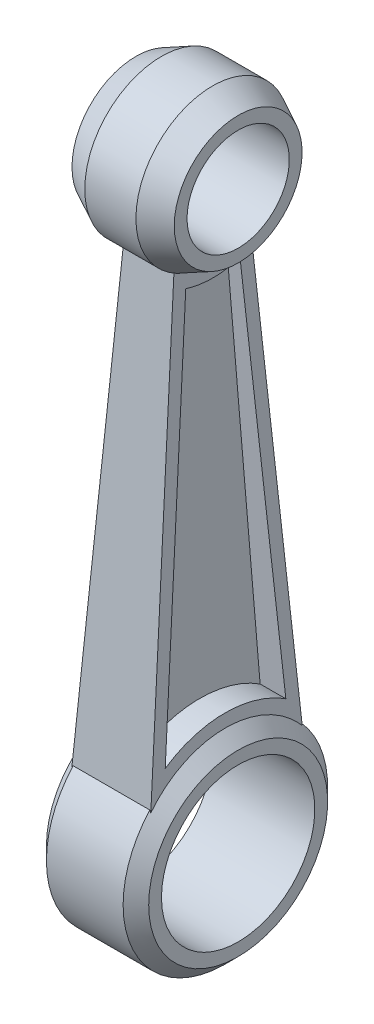
ISO-10303-21;
HEADER;
FILE_DESCRIPTION(('STEP AP214'),'2;1');
FILE_NAME('part.step','',(''),(''),'','','');
FILE_SCHEMA(('AUTOMOTIVE_DESIGN { 1 0 10303 214 1 1 1 1 }'));
ENDSEC;
DATA;
#1=APPLICATION_CONTEXT('core data for automotive mechanical design processes');
#2=APPLICATION_PROTOCOL_DEFINITION('international standard','automotive_design',2000,#1);
#3=PRODUCT_CONTEXT('',#1,'mechanical');
#4=PRODUCT('Part','Part','',(#3));
#5=PRODUCT_RELATED_PRODUCT_CATEGORY('part','',(#4));
#6=PRODUCT_DEFINITION_FORMATION('','',#4);
#7=PRODUCT_DEFINITION_CONTEXT('part definition',#1,'design');
#8=PRODUCT_DEFINITION('design','',#6,#7);
#9=PRODUCT_DEFINITION_SHAPE('','',#8);
#10=(LENGTH_UNIT() NAMED_UNIT(*) SI_UNIT(.MILLI.,.METRE.));
#11=(NAMED_UNIT(*) PLANE_ANGLE_UNIT() SI_UNIT($,.RADIAN.));
#12=(NAMED_UNIT(*) SI_UNIT($,.STERADIAN.) SOLID_ANGLE_UNIT());
#13=UNCERTAINTY_MEASURE_WITH_UNIT(LENGTH_MEASURE(1.E-05),#10,'distance_accuracy_value','');
#14=(GEOMETRIC_REPRESENTATION_CONTEXT(3) GLOBAL_UNCERTAINTY_ASSIGNED_CONTEXT((#13)) GLOBAL_UNIT_ASSIGNED_CONTEXT((#10,
#11,#12)) REPRESENTATION_CONTEXT('',''));
#15=CARTESIAN_POINT('',(0.,0.,0.));
#16=DIRECTION('',(0.,0.,1.));
#17=DIRECTION('',(1.,0.,0.));
#18=AXIS2_PLACEMENT_3D('',#15,#16,#17);
#19=CARTESIAN_POINT('',(2.,39.,0.));
#20=DIRECTION('',(-0.9994801143397,-0.0322412940109581,0.));
#21=DIRECTION('',(0.0322412940109581,-0.9994801143397,0.));
#22=AXIS2_PLACEMENT_3D('',#19,#20,#21);
#23=PLANE('',#22);
#24=DIRECTION('',(-0.0321267246803745,0.995928465091609,-0.0842280593483143));
#25=VECTOR('',#24,1.);
#26=CARTESIAN_POINT('',(2.01332038910498,38.5870679377456,3.10290597295482));
#27=LINE('',#26,#25);
#28=CARTESIAN_POINT('',(3.08888077576671,5.24469595123219,5.92275035428325));
#29=VERTEX_POINT('',#28);
#30=CARTESIAN_POINT('',(1.97406943299054,39.8038475772933,3.));
#31=VERTEX_POINT('',#30);
#32=EDGE_CURVE('E488',#29,#31,#27,.T.);
#33=ORIENTED_EDGE('',*,*,#32,.F.);
#34=CARTESIAN_POINT('',(3.25,0.25,0.));
#35=DIRECTION('',(-0.9994801143397,-0.0322412940109581,0.));
#36=DIRECTION('',(-0.0322412940109581,0.9994801143397,0.));
#37=AXIS2_PLACEMENT_3D('',#34,#35,#36);
#38=ELLIPSE('',#37,7.75403120963541,7.74596669241483);
#39=CARTESIAN_POINT('',(3.08888077576671,5.2446959512322,-5.92275035428325));
#40=VERTEX_POINT('',#39);
#41=EDGE_CURVE('E510',#40,#29,#38,.F.);
#42=ORIENTED_EDGE('',*,*,#41,.F.);
#43=DIRECTION('',(0.0321267246803745,-0.995928465091609,-0.0842280593483142));
#44=VECTOR('',#43,1.);
#45=CARTESIAN_POINT('',(2.01332038910498,38.5870679377456,-3.10290597295482));
#46=LINE('',#45,#44);
#47=CARTESIAN_POINT('',(1.97406943299054,39.8038475772934,-3.));
#48=VERTEX_POINT('',#47);
#49=EDGE_CURVE('E492',#48,#40,#46,.T.);
#50=ORIENTED_EDGE('',*,*,#49,.F.);
#51=CARTESIAN_POINT('',(1.80645161290323,45.,0.));
#52=DIRECTION('',(-0.9994801143397,-0.0322412940109581,0.));
#53=DIRECTION('',(-0.0322412940109581,0.9994801143397,0.));
#54=AXIS2_PLACEMENT_3D('',#51,#52,#53);
#55=ELLIPSE('',#54,6.00312093649194,6.00000000000001);
#56=CARTESIAN_POINT('',(2.,39.,0.));
#57=VERTEX_POINT('',#56);
#58=EDGE_CURVE('E476',#57,#48,#55,.F.);
#59=ORIENTED_EDGE('',*,*,#58,.F.);
#60=EDGE_CURVE('E502',#31,#57,#55,.F.);
#61=ORIENTED_EDGE('',*,*,#60,.F.);
#62=EDGE_LOOP('',(#33,#42,#50,#59,#61));
#63=FACE_BOUND('',#62,.T.);
#64=CARTESIAN_POINT('',(3.0123442683023,7.61732768262882,4.71852132391253));
#65=CARTESIAN_POINT('',(3.00806604240991,7.74995268529293,4.51158144660242));
#66=CARTESIAN_POINT('',(3.00406917587724,7.87385554780555,4.29904385747414));
#67=CARTESIAN_POINT('',(2.99666542594406,8.10337179573424,3.86431802858974));
#68=CARTESIAN_POINT('',(2.99325851068763,8.20898616868343,3.64213031072753));
#69=CARTESIAN_POINT('',(2.98706431982178,8.40100608552498,3.18983515443123));
#70=CARTESIAN_POINT('',(2.98427647515177,8.48742927029526,2.95973521567131));
#71=CARTESIAN_POINT('',(2.97933632956104,8.64057378360785,2.49306845227721));
#72=CARTESIAN_POINT('',(2.97718402121897,8.70729534221189,2.25650170319313));
#73=CARTESIAN_POINT('',(2.97352743279876,8.82064958323831,1.7785521675483));
#74=CARTESIAN_POINT('',(2.97202327337534,8.86727852536455,1.53716849304637));
#75=CARTESIAN_POINT('',(2.96967548609557,8.94005993103735,1.05121977536935));
#76=CARTESIAN_POINT('',(2.96883214969035,8.96620335959924,0.806653376764444));
#77=CARTESIAN_POINT('',(2.96781416775673,8.99776079954137,0.316201086897768));
#78=CARTESIAN_POINT('',(2.96763947796724,9.00317618301546,0.0703152840530583));
#79=CARTESIAN_POINT('',(2.96795748806564,8.99331786996515,-0.421037039626619));
#80=CARTESIAN_POINT('',(2.96845019959297,8.97804381261795,-0.666503553074446));
#81=CARTESIAN_POINT('',(2.9701027727946,8.9268140433674,-1.15534495339835));
#82=CARTESIAN_POINT('',(2.97126275525727,8.89085458702455,-1.39871945348372));
#83=CARTESIAN_POINT('',(2.9734933711298,8.82170549497608,-1.76080126110431));
#84=CARTESIAN_POINT('',(2.97431879150302,8.79611746340644,-1.88101051914152));
#85=CARTESIAN_POINT('',(2.97613318469048,8.73987127459528,-2.12028677892795));
#86=CARTESIAN_POINT('',(2.97712221240622,8.70921141540729,-2.23935338299977));
#87=CARTESIAN_POINT('',(2.97925929516108,8.64296185000654,-2.47591900346926));
#88=CARTESIAN_POINT('',(2.98040711789562,8.60737934523581,-2.59342003977918));
#89=CARTESIAN_POINT('',(2.98285919105712,8.53136507722924,-2.82684477965229));
#90=CARTESIAN_POINT('',(2.98416345722333,8.49093282607675,-2.94276832320072));
#91=CARTESIAN_POINT('',(2.98831148970181,8.36234381924384,-3.28777756364028));
#92=CARTESIAN_POINT('',(2.99139132753833,8.26686884631184,-3.51419487303131));
#93=CARTESIAN_POINT('',(2.99736153293332,8.08179247906707,-3.90563541330948));
#94=CARTESIAN_POINT('',(3.00012517196139,7.99611966919686,-4.07254038576338));
#95=CARTESIAN_POINT('',(3.00598713418035,7.81439884040928,-4.4001967115958));
#96=CARTESIAN_POINT('',(3.00908483146566,7.71837022456454,-4.56095883428714));
#97=CARTESIAN_POINT('',(3.0123442683023,7.61732768262875,-4.7185213239117));
#98=B_SPLINE_CURVE_WITH_KNOTS('',3,(#64,#65,#66,#67,#68,#69,#70,#71,#72,#73,#74,#75,#76,#77,#78,
#79,#80,#81,#82,#83,#84,#85,#86,#87,#88,#89,#90,#91,#92,#93,#94,#95,#96,#97),.UNSPECIFIED.,.F.,
.F.,(4,2,2,2,2,2,2,2,2,2,2,2,2,2,2,2,4),(0.,0.737273480682664,1.47450713800115,2.21106028582351,
2.94760483235695,3.68428642952581,4.4212927520901,5.15825028764485,5.89522067586761,
6.63232451134959,7.00095082870128,7.36970109736712,7.73791750830683,8.10617099538117,
8.84238918119858,9.4049129555388,9.96640049516694),.UNSPECIFIED.);
#99=CARTESIAN_POINT('',(3.0123442683023,7.61732768262882,4.71852132391253));
#100=VERTEX_POINT('',#99);
#101=CARTESIAN_POINT('',(3.0123442683023,7.61732768262875,-4.7185213239117));
#102=VERTEX_POINT('',#101);
#103=EDGE_CURVE('E12',#100,#102,#98,.T.);
#104=ORIENTED_EDGE('',*,*,#103,.F.);
#105=DIRECTION('',(0.0321267246803746,-0.995928465091611,0.0842280593482874));
#106=VECTOR('',#105,1.);
#107=CARTESIAN_POINT('',(1.99441375569753,39.1731735733767,2.04976774006267));
#108=LINE('',#107,#106);
#109=CARTESIAN_POINT('',(2.02164147130858,38.3291143894341,2.12115184999676));
#110=VERTEX_POINT('',#109);
#111=EDGE_CURVE('E68',#110,#100,#108,.T.);
#112=ORIENTED_EDGE('',*,*,#111,.F.);
#113=CARTESIAN_POINT('',(1.80645161290323,45.,0.));
#114=DIRECTION('',(-0.9994801143397,-0.0322412940109581,0.));
#115=DIRECTION('',(0.0322412940109581,-0.9994801143397,0.));
#116=AXIS2_PLACEMENT_3D('',#113,#114,#115);
#117=ELLIPSE('',#116,7.00364109257392,7.);
#118=CARTESIAN_POINT('',(2.02164147130858,38.3291143894341,-2.12115184999676));
#119=VERTEX_POINT('',#118);
#120=EDGE_CURVE('E516',#110,#119,#117,.F.);
#121=ORIENTED_EDGE('',*,*,#120,.T.);
#122=DIRECTION('',(-0.0321267246803746,0.995928465091613,0.0842280593482607));
#123=VECTOR('',#122,1.);
#124=CARTESIAN_POINT('',(1.99441375569753,39.1731735733767,-2.0497677400627));
#125=LINE('',#124,#123);
#126=EDGE_CURVE('E513',#102,#119,#125,.T.);
#127=ORIENTED_EDGE('',*,*,#126,.F.);
#128=EDGE_LOOP('',(#104,#112,#121,#127));
#129=FACE_BOUND('',#128,.T.);
#130=ADVANCED_FACE('F53',(#63,#129),#23,.F.);
#131=CARTESIAN_POINT('',(40.0032823696505,39.8038475772934,-3.));
#132=DIRECTION('',(0.,-0.0842715600283299,0.996442825339413));
#133=DIRECTION('',(0.,-0.996442825339413,-0.0842715600283299));
#134=AXIS2_PLACEMENT_3D('',#131,#132,#133);
#135=PLANE('',#134);
#136=DIRECTION('',(-1.,0.,0.));
#137=VECTOR('',#136,1.);
#138=CARTESIAN_POINT('',(0.,5.39146631945272,-5.91033763216679));
#139=LINE('',#138,#137);
#140=CARTESIAN_POINT('',(-3.,5.39146631945272,-5.91033763216679));
#141=VERTEX_POINT('',#140);
#142=CARTESIAN_POINT('',(3.,5.39146631945272,-5.91033763216679));
#143=VERTEX_POINT('',#142);
#144=EDGE_CURVE('E479',#141,#143,#139,.F.);
#145=ORIENTED_EDGE('',*,*,#144,.F.);
#146=CARTESIAN_POINT('',(-2.9998,5.39179340287246,-5.91030996993737));
#147=CARTESIAN_POINT('',(-3.01978271852244,5.35911867481869,-5.91307335006974));
#148=CARTESIAN_POINT('',(-3.03966955682412,5.32638648699748,-5.91584158971249));
#149=CARTESIAN_POINT('',(-3.07925147549856,5.26080718765726,-5.92138778837079));
#150=CARTESIAN_POINT('',(-3.09894655584697,5.22796007612366,-5.92416574738757));
#151=CARTESIAN_POINT('',(-3.11854575595028,5.19505550480802,-5.92694856591596));
#152=B_SPLINE_CURVE_WITH_KNOTS('',3,(#146,#147,#148,#149,#150,#151),.UNSPECIFIED.,.F.,.F.,(4,2,
4),(0.,0.115199437807998,0.230398890241468),.UNSPECIFIED.);
#153=CARTESIAN_POINT('',(-3.08888077576671,5.2446959512322,-5.92275035428325));
#154=VERTEX_POINT('',#153);
#155=EDGE_CURVE('E226',#141,#154,#152,.T.);
#156=ORIENTED_EDGE('',*,*,#155,.T.);
#157=DIRECTION('',(-0.0321267246803745,-0.995928465091609,-0.0842280593483142));
#158=VECTOR('',#157,1.);
#159=CARTESIAN_POINT('',(-2.01332038910498,38.5870679377456,-3.10290597295482));
#160=LINE('',#159,#158);
#161=CARTESIAN_POINT('',(-1.97406943299054,39.8038475772934,-3.));
#162=VERTEX_POINT('',#161);
#163=EDGE_CURVE('E459',#162,#154,#160,.T.);
#164=ORIENTED_EDGE('',*,*,#163,.F.);
#165=DIRECTION('',(-1.,0.,0.));
#166=VECTOR('',#165,1.);
#167=CARTESIAN_POINT('',(40.0032823696505,39.8038475772934,-3.));
#168=LINE('',#167,#166);
#169=EDGE_CURVE('E474',#48,#162,#168,.T.);
#170=ORIENTED_EDGE('',*,*,#169,.F.);
#171=ORIENTED_EDGE('',*,*,#49,.T.);
#172=CARTESIAN_POINT('',(2.9998,5.39179340287246,-5.91030996993737));
#173=CARTESIAN_POINT('',(3.01978271852244,5.35911867481869,-5.91307335006974));
#174=CARTESIAN_POINT('',(3.03966955682412,5.32638648699748,-5.91584158971249));
#175=CARTESIAN_POINT('',(3.07925147549856,5.26080718765726,-5.92138778837079));
#176=CARTESIAN_POINT('',(3.09894655584697,5.22796007612366,-5.92416574738757));
#177=CARTESIAN_POINT('',(3.11854575595028,5.19505550480802,-5.92694856591596));
#178=B_SPLINE_CURVE_WITH_KNOTS('',3,(#172,#173,#174,#175,#176,#177),.UNSPECIFIED.,.F.,.F.,(4,2,
4),(0.,0.115199437807998,0.230398890241468),.UNSPECIFIED.);
#179=EDGE_CURVE('E82',#143,#40,#178,.T.);
#180=ORIENTED_EDGE('',*,*,#179,.F.);
#181=EDGE_LOOP('',(#145,#156,#164,#170,#171,#180));
#182=FACE_BOUND('',#181,.T.);
#183=ADVANCED_FACE('F365',(#182),#135,.F.);
#184=CARTESIAN_POINT('',(40.0032823696505,39.8038475772933,3.));
#185=DIRECTION('',(0.,-0.0842715600283299,-0.996442825339413));
#186=DIRECTION('',(0.,0.996442825339413,-0.0842715600283299));
#187=AXIS2_PLACEMENT_3D('',#184,#185,#186);
#188=PLANE('',#187);
#189=DIRECTION('',(-1.,0.,0.));
#190=VECTOR('',#189,1.);
#191=CARTESIAN_POINT('',(0.,5.39146631945272,5.91033763216679));
#192=LINE('',#191,#190);
#193=CARTESIAN_POINT('',(3.,5.39146631945272,5.91033763216679));
#194=VERTEX_POINT('',#193);
#195=CARTESIAN_POINT('',(-3.,5.39146631945272,5.91033763216679));
#196=VERTEX_POINT('',#195);
#197=EDGE_CURVE('E759',#194,#196,#192,.T.);
#198=ORIENTED_EDGE('',*,*,#197,.F.);
#199=CARTESIAN_POINT('',(3.11854575595027,5.19505550480804,5.92694856591595));
#200=CARTESIAN_POINT('',(3.09894655584697,5.22796007612367,5.92416574738757));
#201=CARTESIAN_POINT('',(3.07925147549855,5.26080718765727,5.92138778837078));
#202=CARTESIAN_POINT('',(3.03966955682412,5.32638648699748,5.91584158971249));
#203=CARTESIAN_POINT('',(3.01978271852244,5.35911867481869,5.91307335006974));
#204=CARTESIAN_POINT('',(2.9998,5.39179340287246,5.91030996993737));
#205=B_SPLINE_CURVE_WITH_KNOTS('',3,(#199,#200,#201,#202,#203,#204),.UNSPECIFIED.,.F.,.F.,(4,2,
4),(0.,0.115199452433459,0.230398890241447),.UNSPECIFIED.);
#206=EDGE_CURVE('E346',#29,#194,#205,.T.);
#207=ORIENTED_EDGE('',*,*,#206,.F.);
#208=ORIENTED_EDGE('',*,*,#32,.T.);
#209=DIRECTION('',(-1.,0.,0.));
#210=VECTOR('',#209,1.);
#211=CARTESIAN_POINT('',(40.0032823696505,39.8038475772933,3.));
#212=LINE('',#211,#210);
#213=CARTESIAN_POINT('',(-1.97406943299054,39.8038475772933,3.));
#214=VERTEX_POINT('',#213);
#215=EDGE_CURVE('E478',#31,#214,#212,.T.);
#216=ORIENTED_EDGE('',*,*,#215,.T.);
#217=DIRECTION('',(0.0321267246803745,0.995928465091609,-0.0842280593483143));
#218=VECTOR('',#217,1.);
#219=CARTESIAN_POINT('',(-2.01332038910498,38.5870679377456,3.10290597295482));
#220=LINE('',#219,#218);
#221=CARTESIAN_POINT('',(-3.08888077576671,5.24469595123219,5.92275035428325));
#222=VERTEX_POINT('',#221);
#223=EDGE_CURVE('E428',#222,#214,#220,.T.);
#224=ORIENTED_EDGE('',*,*,#223,.F.);
#225=CARTESIAN_POINT('',(-3.11854575595027,5.19505550480804,5.92694856591595));
#226=CARTESIAN_POINT('',(-3.09894655584697,5.22796007612367,5.92416574738757));
#227=CARTESIAN_POINT('',(-3.07925147549855,5.26080718765727,5.92138778837078));
#228=CARTESIAN_POINT('',(-3.03966955682412,5.32638648699748,5.91584158971249));
#229=CARTESIAN_POINT('',(-3.01978271852244,5.35911867481869,5.91307335006974));
#230=CARTESIAN_POINT('',(-2.9998,5.39179340287246,5.91030996993737));
#231=B_SPLINE_CURVE_WITH_KNOTS('',3,(#225,#226,#227,#228,#229,#230),.UNSPECIFIED.,.F.,.F.,(4,2,
4),(0.,0.115199452433459,0.230398890241447),.UNSPECIFIED.);
#232=EDGE_CURVE('E216',#222,#196,#231,.T.);
#233=ORIENTED_EDGE('',*,*,#232,.T.);
#234=EDGE_LOOP('',(#198,#207,#208,#216,#224,#233));
#235=FACE_BOUND('',#234,.T.);
#236=ADVANCED_FACE('F361',(#235),#188,.F.);
#237=CARTESIAN_POINT('',(0.,45.,0.));
#238=DIRECTION('',(-1.,0.,0.));
#239=DIRECTION('',(0.,0.,1.));
#240=AXIS2_PLACEMENT_3D('',#237,#238,#239);
#241=CYLINDRICAL_SURFACE('',#240,6.);
#242=ORIENTED_EDGE('',*,*,#169,.T.);
#243=CARTESIAN_POINT('',(-1.80645161290323,45.,0.));
#244=DIRECTION('',(-0.9994801143397,0.0322412940109581,0.));
#245=DIRECTION('',(0.0322412940109581,0.9994801143397,0.));
#246=AXIS2_PLACEMENT_3D('',#243,#244,#245);
#247=ELLIPSE('',#246,6.00312093649194,6.00000000000001);
#248=CARTESIAN_POINT('',(-2.,39.,0.));
#249=VERTEX_POINT('',#248);
#250=EDGE_CURVE('E464',#249,#162,#247,.F.);
#251=ORIENTED_EDGE('',*,*,#250,.F.);
#252=CARTESIAN_POINT('',(-2.,45.,0.));
#253=DIRECTION('',(-1.,0.,0.));
#254=DIRECTION('',(0.,0.,1.));
#255=AXIS2_PLACEMENT_3D('',#252,#253,#254);
#256=CIRCLE('',#255,6.);
#257=EDGE_CURVE('E455',#249,#249,#256,.T.);
#258=ORIENTED_EDGE('',*,*,#257,.F.);
#259=EDGE_CURVE('E458',#214,#249,#247,.F.);
#260=ORIENTED_EDGE('',*,*,#259,.F.);
#261=ORIENTED_EDGE('',*,*,#215,.F.);
#262=ORIENTED_EDGE('',*,*,#60,.T.);
#263=CARTESIAN_POINT('',(2.,45.,0.));
#264=DIRECTION('',(-1.,0.,0.));
#265=DIRECTION('',(0.,0.,1.));
#266=AXIS2_PLACEMENT_3D('',#263,#264,#265);
#267=CIRCLE('',#266,6.);
#268=EDGE_CURVE('E498',#57,#57,#267,.T.);
#269=ORIENTED_EDGE('',*,*,#268,.T.);
#270=ORIENTED_EDGE('',*,*,#58,.T.);
#271=EDGE_LOOP('',(#242,#251,#258,#260,#261,#262,#269,#270));
#272=FACE_BOUND('',#271,.T.);
#273=ADVANCED_FACE('F55',(#272),#241,.T.);
#274=CARTESIAN_POINT('',(0.,45.,0.));
#275=DIRECTION('',(-1.,0.,0.));
#276=DIRECTION('',(0.,0.,1.));
#277=AXIS2_PLACEMENT_3D('',#274,#275,#276);
#278=CYLINDRICAL_SURFACE('',#277,4.);
#279=CARTESIAN_POINT('',(4.,45.,0.));
#280=DIRECTION('',(-1.,0.,0.));
#281=DIRECTION('',(0.,0.,1.));
#282=AXIS2_PLACEMENT_3D('',#279,#280,#281);
#283=CIRCLE('',#282,4.);
#284=CARTESIAN_POINT('',(4.,45.,4.));
#285=VERTEX_POINT('',#284);
#286=EDGE_CURVE('E506',#285,#285,#283,.T.);
#287=ORIENTED_EDGE('',*,*,#286,.F.);
#288=EDGE_LOOP('',(#287));
#289=FACE_BOUND('',#288,.T.);
#290=CARTESIAN_POINT('',(-4.,45.,0.));
#291=DIRECTION('',(-1.,0.,0.));
#292=DIRECTION('',(0.,0.,1.));
#293=AXIS2_PLACEMENT_3D('',#290,#291,#292);
#294=CIRCLE('',#293,4.);
#295=CARTESIAN_POINT('',(-4.,45.,4.));
#296=VERTEX_POINT('',#295);
#297=EDGE_CURVE('E447',#296,#296,#294,.T.);
#298=ORIENTED_EDGE('',*,*,#297,.T.);
#299=EDGE_LOOP('',(#298));
#300=FACE_BOUND('',#299,.T.);
#301=ADVANCED_FACE('F375',(#289,#300),#278,.F.);
#302=CARTESIAN_POINT('',(4.,49.,0.));
#303=DIRECTION('',(-1.,0.,0.));
#304=DIRECTION('',(0.,0.,1.));
#305=AXIS2_PLACEMENT_3D('',#302,#303,#304);
#306=PLANE('',#305);
#307=CARTESIAN_POINT('',(4.,45.,0.));
#308=DIRECTION('',(-1.,0.,0.));
#309=DIRECTION('',(0.,0.,1.));
#310=AXIS2_PLACEMENT_3D('',#307,#308,#309);
#311=CIRCLE('',#310,5.);
#312=CARTESIAN_POINT('',(4.,45.,5.));
#313=VERTEX_POINT('',#312);
#314=EDGE_CURVE('E501',#313,#313,#311,.T.);
#315=ORIENTED_EDGE('',*,*,#314,.F.);
#316=EDGE_LOOP('',(#315));
#317=FACE_BOUND('',#316,.T.);
#318=ORIENTED_EDGE('',*,*,#286,.T.);
#319=EDGE_LOOP('',(#318));
#320=FACE_BOUND('',#319,.T.);
#321=ADVANCED_FACE('F372',(#317,#320),#306,.F.);
#322=CARTESIAN_POINT('',(4.,45.,0.));
#323=DIRECTION('',(-1.,0.,0.));
#324=DIRECTION('',(0.,0.,1.));
#325=AXIS2_PLACEMENT_3D('',#322,#323,#324);
#326=CONICAL_SURFACE('',#325,5.,0.463647609000806);
#327=ORIENTED_EDGE('',*,*,#268,.F.);
#328=EDGE_LOOP('',(#327));
#329=FACE_BOUND('',#328,.T.);
#330=ORIENTED_EDGE('',*,*,#314,.T.);
#331=EDGE_LOOP('',(#330));
#332=FACE_BOUND('',#331,.T.);
#333=ADVANCED_FACE('F368',(#329,#332),#326,.T.);
#334=CARTESIAN_POINT('',(0.,0.,0.));
#335=DIRECTION('',(-1.,0.,0.));
#336=DIRECTION('',(0.,0.,1.));
#337=AXIS2_PLACEMENT_3D('',#334,#335,#336);
#338=CYLINDRICAL_SURFACE('',#337,8.);
#339=ORIENTED_EDGE('',*,*,#197,.T.);
#340=CARTESIAN_POINT('',(-3.,0.,0.));
#341=DIRECTION('',(-1.,0.,0.));
#342=DIRECTION('',(0.,0.,1.));
#343=AXIS2_PLACEMENT_3D('',#340,#341,#342);
#344=CIRCLE('',#343,8.);
#345=EDGE_CURVE('E196',#141,#196,#344,.T.);
#346=ORIENTED_EDGE('',*,*,#345,.F.);
#347=ORIENTED_EDGE('',*,*,#144,.T.);
#348=CARTESIAN_POINT('',(3.,0.,0.));
#349=DIRECTION('',(-1.,0.,0.));
#350=DIRECTION('',(0.,0.,1.));
#351=AXIS2_PLACEMENT_3D('',#348,#349,#350);
#352=CIRCLE('',#351,8.);
#353=EDGE_CURVE('E326',#143,#194,#352,.T.);
#354=ORIENTED_EDGE('',*,*,#353,.T.);
#355=EDGE_LOOP('',(#339,#346,#347,#354));
#356=FACE_BOUND('',#355,.T.);
#357=ADVANCED_FACE('F371',(#356),#338,.T.);
#358=CARTESIAN_POINT('',(4.,0.,0.));
#359=DIRECTION('',(-1.,0.,0.));
#360=DIRECTION('',(0.,0.,1.));
#361=AXIS2_PLACEMENT_3D('',#358,#359,#360);
#362=CONICAL_SURFACE('',#361,7.,0.785398163397448);
#363=CARTESIAN_POINT('',(4.,0.,0.));
#364=DIRECTION('',(-1.,0.,0.));
#365=DIRECTION('',(0.,0.,1.));
#366=AXIS2_PLACEMENT_3D('',#363,#364,#365);
#367=CIRCLE('',#366,7.);
#368=CARTESIAN_POINT('',(4.,0.,7.));
#369=VERTEX_POINT('',#368);
#370=EDGE_CURVE('E331',#369,#369,#367,.T.);
#371=ORIENTED_EDGE('',*,*,#370,.T.);
#372=EDGE_LOOP('',(#371));
#373=FACE_BOUND('',#372,.T.);
#374=ORIENTED_EDGE('',*,*,#353,.F.);
#375=ORIENTED_EDGE('',*,*,#179,.T.);
#376=ORIENTED_EDGE('',*,*,#41,.T.);
#377=ORIENTED_EDGE('',*,*,#206,.T.);
#378=EDGE_LOOP('',(#374,#375,#376,#377));
#379=FACE_BOUND('',#378,.T.);
#380=ADVANCED_FACE('F293',(#373,#379),#362,.T.);
#381=CARTESIAN_POINT('',(0.,0.,0.));
#382=DIRECTION('',(-1.,0.,0.));
#383=DIRECTION('',(0.,0.,1.));
#384=AXIS2_PLACEMENT_3D('',#381,#382,#383);
#385=CYLINDRICAL_SURFACE('',#384,6.);
#386=CARTESIAN_POINT('',(4.,0.,0.));
#387=DIRECTION('',(-1.,0.,0.));
#388=DIRECTION('',(0.,0.,1.));
#389=AXIS2_PLACEMENT_3D('',#386,#387,#388);
#390=CIRCLE('',#389,6.);
#391=CARTESIAN_POINT('',(4.,0.,6.));
#392=VERTEX_POINT('',#391);
#393=EDGE_CURVE('E342',#392,#392,#390,.T.);
#394=ORIENTED_EDGE('',*,*,#393,.F.);
#395=EDGE_LOOP('',(#394));
#396=FACE_BOUND('',#395,.T.);
#397=CARTESIAN_POINT('',(-4.,0.,0.));
#398=DIRECTION('',(-1.,0.,0.));
#399=DIRECTION('',(0.,0.,1.));
#400=AXIS2_PLACEMENT_3D('',#397,#398,#399);
#401=CIRCLE('',#400,6.);
#402=CARTESIAN_POINT('',(-4.,0.,6.));
#403=VERTEX_POINT('',#402);
#404=EDGE_CURVE('E212',#403,#403,#401,.T.);
#405=ORIENTED_EDGE('',*,*,#404,.T.);
#406=EDGE_LOOP('',(#405));
#407=FACE_BOUND('',#406,.T.);
#408=ADVANCED_FACE('F397',(#396,#407),#385,.F.);
#409=CARTESIAN_POINT('',(4.,6.,0.));
#410=DIRECTION('',(-1.,0.,0.));
#411=DIRECTION('',(0.,0.,1.));
#412=AXIS2_PLACEMENT_3D('',#409,#410,#411);
#413=PLANE('',#412);
#414=ORIENTED_EDGE('',*,*,#370,.F.);
#415=EDGE_LOOP('',(#414));
#416=FACE_BOUND('',#415,.T.);
#417=ORIENTED_EDGE('',*,*,#393,.T.);
#418=EDGE_LOOP('',(#417));
#419=FACE_BOUND('',#418,.T.);
#420=ADVANCED_FACE('F292',(#416,#419),#413,.F.);
#421=CARTESIAN_POINT('',(1.,7.61732768262875,-4.7185213239117));
#422=CARTESIAN_POINT('',(1.,8.07025795693203,-4.01198425534394));
#423=CARTESIAN_POINT('',(1.,8.4107405918881,-3.2615503615427));
#424=CARTESIAN_POINT('',(1.,8.70234147082911,-2.27119670865189));
#425=CARTESIAN_POINT('',(1.,8.75383204519997,-2.07045986768154));
#426=CARTESIAN_POINT('',(1.,8.84279289802945,-1.66351300299607));
#427=CARTESIAN_POINT('',(1.,8.88035061971134,-1.45644603214192));
#428=CARTESIAN_POINT('',(1.,8.96990894859625,-0.836431360684937));
#429=CARTESIAN_POINT('',(1.,9.02920540170382,-0.00941084225722296));
#430=CARTESIAN_POINT('',(1.,8.97166067954541,0.818259414860088));
#431=CARTESIAN_POINT('',(1.,8.85376903934497,1.64626525339688));
#432=CARTESIAN_POINT('',(1.,8.76494999754429,2.05569538009596));
#433=CARTESIAN_POINT('',(1.,8.5325251363334,2.85069044441716));
#434=CARTESIAN_POINT('',(1.,8.3886016803718,3.23863975479659));
#435=CARTESIAN_POINT('',(1.,8.04477705217636,3.99525046964435));
#436=CARTESIAN_POINT('',(1.,7.84379330238342,4.36525203680448));
#437=CARTESIAN_POINT('',(1.,7.61732768262882,4.71852132391253));
#438=B_SPLINE_CURVE_WITH_KNOTS('',3,(#421,#422,#423,#424,#425,#426,#427,#428,#429,#430,#431,
#432,#433,#434,#435,#436,#437),.UNSPECIFIED.,.F.,.F.,(4,2,2,2,1,2,2,2,4),(0.,0.249999999999999,
0.312499999999999,0.374999999999999,0.499999999999999,0.625,0.75,0.875,1.),.UNSPECIFIED.);
#439=DIRECTION('',(1.,0.,0.));
#440=VECTOR('',#439,1.);
#441=SURFACE_OF_LINEAR_EXTRUSION('',#438,#440);
#442=ORIENTED_EDGE('',*,*,#103,.T.);
#443=DIRECTION('',(1.,0.,0.));
#444=VECTOR('',#443,1.);
#445=CARTESIAN_POINT('',(1.,7.61732768262875,-4.7185213239117));
#446=LINE('',#445,#444);
#447=CARTESIAN_POINT('',(1.,7.61732768262875,-4.7185213239117));
#448=VERTEX_POINT('',#447);
#449=EDGE_CURVE('E75',#448,#102,#446,.T.);
#450=ORIENTED_EDGE('',*,*,#449,.F.);
#451=CARTESIAN_POINT('',(1.,7.61732768262875,-4.7185213239117));
#452=CARTESIAN_POINT('',(1.,8.07025795693203,-4.01198425534394));
#453=CARTESIAN_POINT('',(1.,8.4107405918881,-3.2615503615427));
#454=CARTESIAN_POINT('',(1.,8.70234147082911,-2.27119670865189));
#455=CARTESIAN_POINT('',(1.,8.75383204519997,-2.07045986768154));
#456=CARTESIAN_POINT('',(1.,8.84279289802945,-1.66351300299607));
#457=CARTESIAN_POINT('',(1.,8.88035061971134,-1.45644603214192));
#458=CARTESIAN_POINT('',(1.,8.96990894859625,-0.836431360684937));
#459=CARTESIAN_POINT('',(1.,9.02920540170382,-0.00941084225722296));
#460=CARTESIAN_POINT('',(1.,8.97166067954541,0.818259414860088));
#461=CARTESIAN_POINT('',(1.,8.85376903934497,1.64626525339688));
#462=CARTESIAN_POINT('',(1.,8.76494999754429,2.05569538009596));
#463=CARTESIAN_POINT('',(1.,8.5325251363334,2.85069044441716));
#464=CARTESIAN_POINT('',(1.,8.3886016803718,3.23863975479659));
#465=CARTESIAN_POINT('',(1.,8.04477705217636,3.99525046964435));
#466=CARTESIAN_POINT('',(1.,7.84379330238342,4.36525203680448));
#467=CARTESIAN_POINT('',(1.,7.61732768262882,4.71852132391253));
#468=B_SPLINE_CURVE_WITH_KNOTS('',3,(#451,#452,#453,#454,#455,#456,#457,#458,#459,#460,#461,
#462,#463,#464,#465,#466,#467),.UNSPECIFIED.,.F.,.F.,(4,2,2,2,1,2,2,2,4),(0.,0.249999999999999,
0.312499999999999,0.374999999999999,0.499999999999999,0.625,0.75,0.875,1.),.UNSPECIFIED.);
#469=CARTESIAN_POINT('',(1.,7.61732768262882,4.71852132391253));
#470=VERTEX_POINT('',#469);
#471=EDGE_CURVE('E273',#448,#470,#468,.T.);
#472=ORIENTED_EDGE('',*,*,#471,.T.);
#473=DIRECTION('',(1.,0.,0.));
#474=VECTOR('',#473,1.);
#475=CARTESIAN_POINT('',(1.,7.61732768262882,4.71852132391253));
#476=LINE('',#475,#474);
#477=EDGE_CURVE('E321',#470,#100,#476,.T.);
#478=ORIENTED_EDGE('',*,*,#477,.T.);
#479=EDGE_LOOP('',(#442,#450,#472,#478));
#480=FACE_BOUND('',#479,.T.);
#481=ADVANCED_FACE('F280',(#480),#441,.T.);
#482=CARTESIAN_POINT('',(1.,7.61732768262882,4.71852132391253));
#483=DIRECTION('',(0.,-0.0842715600283031,-0.996442825339415));
#484=DIRECTION('',(0.,0.996442825339415,-0.0842715600283031));
#485=AXIS2_PLACEMENT_3D('',#482,#483,#484);
#486=PLANE('',#485);
#487=ORIENTED_EDGE('',*,*,#111,.T.);
#488=ORIENTED_EDGE('',*,*,#477,.F.);
#489=DIRECTION('',(0.,0.996442825339415,-0.0842715600283031));
#490=VECTOR('',#489,1.);
#491=CARTESIAN_POINT('',(1.,7.61732768262882,4.71852132391253));
#492=LINE('',#491,#490);
#493=CARTESIAN_POINT('',(1.,38.3291143894341,2.12115184999676));
#494=VERTEX_POINT('',#493);
#495=EDGE_CURVE('E314',#470,#494,#492,.T.);
#496=ORIENTED_EDGE('',*,*,#495,.T.);
#497=DIRECTION('',(1.,0.,0.));
#498=VECTOR('',#497,1.);
#499=CARTESIAN_POINT('',(1.,38.3291143894341,2.12115184999676));
#500=LINE('',#499,#498);
#501=EDGE_CURVE('E318',#494,#110,#500,.T.);
#502=ORIENTED_EDGE('',*,*,#501,.T.);
#503=EDGE_LOOP('',(#487,#488,#496,#502));
#504=FACE_BOUND('',#503,.T.);
#505=ADVANCED_FACE('F291',(#504),#486,.T.);
#506=CARTESIAN_POINT('',(1.,45.,0.));
#507=DIRECTION('',(1.,0.,0.));
#508=DIRECTION('',(0.,0.,-1.));
#509=AXIS2_PLACEMENT_3D('',#506,#507,#508);
#510=CYLINDRICAL_SURFACE('',#509,7.);
#511=ORIENTED_EDGE('',*,*,#501,.F.);
#512=CARTESIAN_POINT('',(1.,45.,0.));
#513=DIRECTION('',(-1.,0.,0.));
#514=DIRECTION('',(0.,0.,1.));
#515=AXIS2_PLACEMENT_3D('',#512,#513,#514);
#516=CIRCLE('',#515,7.00000000000001);
#517=CARTESIAN_POINT('',(1.,38.3291143894341,-2.12115184999676));
#518=VERTEX_POINT('',#517);
#519=EDGE_CURVE('E307',#518,#494,#516,.T.);
#520=ORIENTED_EDGE('',*,*,#519,.F.);
#521=DIRECTION('',(1.,0.,0.));
#522=VECTOR('',#521,1.);
#523=CARTESIAN_POINT('',(1.,38.3291143894341,-2.12115184999676));
#524=LINE('',#523,#522);
#525=EDGE_CURVE('E315',#518,#119,#524,.T.);
#526=ORIENTED_EDGE('',*,*,#525,.T.);
#527=ORIENTED_EDGE('',*,*,#120,.F.);
#528=EDGE_LOOP('',(#511,#520,#526,#527));
#529=FACE_BOUND('',#528,.T.);
#530=ADVANCED_FACE('F531',(#529),#510,.T.);
#531=CARTESIAN_POINT('',(1.,38.3291143894341,-2.12115184999676));
#532=DIRECTION('',(0.,-0.0842715600282763,0.996442825339417));
#533=DIRECTION('',(0.,-0.996442825339417,-0.0842715600282763));
#534=AXIS2_PLACEMENT_3D('',#531,#532,#533);
#535=PLANE('',#534);
#536=ORIENTED_EDGE('',*,*,#126,.T.);
#537=ORIENTED_EDGE('',*,*,#525,.F.);
#538=DIRECTION('',(0.,-0.996442825339417,-0.0842715600282763));
#539=VECTOR('',#538,1.);
#540=CARTESIAN_POINT('',(1.,38.3291143894341,-2.12115184999676));
#541=LINE('',#540,#539);
#542=EDGE_CURVE('E278',#518,#448,#541,.T.);
#543=ORIENTED_EDGE('',*,*,#542,.T.);
#544=ORIENTED_EDGE('',*,*,#449,.T.);
#545=EDGE_LOOP('',(#536,#537,#543,#544));
#546=FACE_BOUND('',#545,.T.);
#547=ADVANCED_FACE('F254',(#546),#535,.T.);
#548=CARTESIAN_POINT('',(1.,8.99999510788732,-0.00924840758481826));
#549=DIRECTION('',(-1.,0.,0.));
#550=DIRECTION('',(0.,0.,1.));
#551=AXIS2_PLACEMENT_3D('',#548,#549,#550);
#552=PLANE('',#551);
#553=ORIENTED_EDGE('',*,*,#471,.F.);
#554=ORIENTED_EDGE('',*,*,#542,.F.);
#555=ORIENTED_EDGE('',*,*,#519,.T.);
#556=ORIENTED_EDGE('',*,*,#495,.F.);
#557=EDGE_LOOP('',(#553,#554,#555,#556));
#558=FACE_BOUND('',#557,.T.);
#559=ADVANCED_FACE('F250',(#558),#552,.F.);
#560=CARTESIAN_POINT('',(-2.,39.,0.));
#561=DIRECTION('',(0.9994801143397,-0.0322412940109581,0.));
#562=DIRECTION('',(-0.0322412940109581,-0.9994801143397,0.));
#563=AXIS2_PLACEMENT_3D('',#560,#561,#562);
#564=PLANE('',#563);
#565=ORIENTED_EDGE('',*,*,#223,.T.);
#566=ORIENTED_EDGE('',*,*,#259,.T.);
#567=ORIENTED_EDGE('',*,*,#250,.T.);
#568=ORIENTED_EDGE('',*,*,#163,.T.);
#569=CARTESIAN_POINT('',(-3.25,0.25,0.));
#570=DIRECTION('',(-0.9994801143397,0.0322412940109581,0.));
#571=DIRECTION('',(0.0322412940109581,0.9994801143397,0.));
#572=AXIS2_PLACEMENT_3D('',#569,#570,#571);
#573=ELLIPSE('',#572,7.75403120963541,7.74596669241483);
#574=EDGE_CURVE('E444',#154,#222,#573,.F.);
#575=ORIENTED_EDGE('',*,*,#574,.T.);
#576=EDGE_LOOP('',(#565,#566,#567,#568,#575));
#577=FACE_BOUND('',#576,.T.);
#578=CARTESIAN_POINT('',(-3.0123442683023,7.61732768262882,4.71852132391253));
#579=CARTESIAN_POINT('',(-3.00806604240991,7.74995268529293,4.51158144660242));
#580=CARTESIAN_POINT('',(-3.00406917587724,7.87385554780555,4.29904385747414));
#581=CARTESIAN_POINT('',(-2.99666542594406,8.10337179573424,3.86431802858974));
#582=CARTESIAN_POINT('',(-2.99325851068763,8.20898616868343,3.64213031072753));
#583=CARTESIAN_POINT('',(-2.98706431982178,8.40100608552498,3.18983515443123));
#584=CARTESIAN_POINT('',(-2.98427647515177,8.48742927029526,2.95973521567131));
#585=CARTESIAN_POINT('',(-2.97933632956104,8.64057378360785,2.49306845227721));
#586=CARTESIAN_POINT('',(-2.97718402121897,8.70729534221189,2.25650170319313));
#587=CARTESIAN_POINT('',(-2.97352743279876,8.82064958323831,1.7785521675483));
#588=CARTESIAN_POINT('',(-2.97202327337534,8.86727852536455,1.53716849304637));
#589=CARTESIAN_POINT('',(-2.96967548609557,8.94005993103735,1.05121977536935));
#590=CARTESIAN_POINT('',(-2.96883214969035,8.96620335959924,0.806653376764444));
#591=CARTESIAN_POINT('',(-2.96781416775673,8.99776079954137,0.316201086897768));
#592=CARTESIAN_POINT('',(-2.96763947796724,9.00317618301546,0.0703152840530583));
#593=CARTESIAN_POINT('',(-2.96795748806564,8.99331786996515,-0.421037039626619));
#594=CARTESIAN_POINT('',(-2.96845019959297,8.97804381261795,-0.666503553074446));
#595=CARTESIAN_POINT('',(-2.9701027727946,8.9268140433674,-1.15534495339835));
#596=CARTESIAN_POINT('',(-2.97126275525727,8.89085458702455,-1.39871945348372));
#597=CARTESIAN_POINT('',(-2.9734933711298,8.82170549497608,-1.76080126110431));
#598=CARTESIAN_POINT('',(-2.97431879150302,8.79611746340644,-1.88101051914152));
#599=CARTESIAN_POINT('',(-2.97613318469048,8.73987127459528,-2.12028677892795));
#600=CARTESIAN_POINT('',(-2.97712221240622,8.70921141540729,-2.23935338299977));
#601=CARTESIAN_POINT('',(-2.97925929516108,8.64296185000654,-2.47591900346926));
#602=CARTESIAN_POINT('',(-2.98040711789562,8.60737934523581,-2.59342003977918));
#603=CARTESIAN_POINT('',(-2.98285919105712,8.53136507722924,-2.82684477965229));
#604=CARTESIAN_POINT('',(-2.98416345722333,8.49093282607675,-2.94276832320072));
#605=CARTESIAN_POINT('',(-2.98831148970181,8.36234381924384,-3.28777756364028));
#606=CARTESIAN_POINT('',(-2.99139132753833,8.26686884631184,-3.51419487303131));
#607=CARTESIAN_POINT('',(-2.99736153293332,8.08179247906707,-3.90563541330948));
#608=CARTESIAN_POINT('',(-3.00012517196139,7.99611966919686,-4.07254038576338));
#609=CARTESIAN_POINT('',(-3.00598713418035,7.81439884040928,-4.4001967115958));
#610=CARTESIAN_POINT('',(-3.00908483146566,7.71837022456454,-4.56095883428714));
#611=CARTESIAN_POINT('',(-3.0123442683023,7.61732768262875,-4.7185213239117));
#612=B_SPLINE_CURVE_WITH_KNOTS('',3,(#578,#579,#580,#581,#582,#583,#584,#585,#586,#587,#588,
#589,#590,#591,#592,#593,#594,#595,#596,#597,#598,#599,#600,#601,#602,#603,#604,#605,#606,#607,
#608,#609,#610,#611),.UNSPECIFIED.,.F.,.F.,(4,2,2,2,2,2,2,2,2,2,2,2,2,2,2,2,4),(0.,
0.737273480682664,1.47450713800115,2.21106028582351,2.94760483235695,3.68428642952581,
4.4212927520901,5.15825028764485,5.89522067586761,6.63232451134959,7.00095082870128,
7.36970109736712,7.73791750830683,8.10617099538117,8.84238918119858,9.4049129555388,
9.96640049516694),.UNSPECIFIED.);
#613=CARTESIAN_POINT('',(-3.0123442683023,7.61732768262882,4.71852132391253));
#614=VERTEX_POINT('',#613);
#615=CARTESIAN_POINT('',(-3.0123442683023,7.61732768262875,-4.7185213239117));
#616=VERTEX_POINT('',#615);
#617=EDGE_CURVE('E194',#614,#616,#612,.T.);
#618=ORIENTED_EDGE('',*,*,#617,.T.);
#619=DIRECTION('',(0.0321267246803746,0.995928465091613,0.0842280593482607));
#620=VECTOR('',#619,1.);
#621=CARTESIAN_POINT('',(-1.99441375569753,39.1731735733767,-2.0497677400627));
#622=LINE('',#621,#620);
#623=CARTESIAN_POINT('',(-2.02164147130858,38.3291143894341,-2.12115184999676));
#624=VERTEX_POINT('',#623);
#625=EDGE_CURVE('E432',#616,#624,#622,.T.);
#626=ORIENTED_EDGE('',*,*,#625,.T.);
#627=CARTESIAN_POINT('',(-1.80645161290323,45.,0.));
#628=DIRECTION('',(-0.9994801143397,0.0322412940109581,0.));
#629=DIRECTION('',(-0.0322412940109581,-0.9994801143397,0.));
#630=AXIS2_PLACEMENT_3D('',#627,#628,#629);
#631=ELLIPSE('',#630,7.00364109257392,7.);
#632=CARTESIAN_POINT('',(-2.02164147130858,38.3291143894341,2.12115184999676));
#633=VERTEX_POINT('',#632);
#634=EDGE_CURVE('E437',#633,#624,#631,.F.);
#635=ORIENTED_EDGE('',*,*,#634,.F.);
#636=DIRECTION('',(-0.0321267246803746,-0.995928465091611,0.0842280593482874));
#637=VECTOR('',#636,1.);
#638=CARTESIAN_POINT('',(-1.99441375569753,39.1731735733767,2.04976774006267));
#639=LINE('',#638,#637);
#640=EDGE_CURVE('E433',#633,#614,#639,.T.);
#641=ORIENTED_EDGE('',*,*,#640,.T.);
#642=EDGE_LOOP('',(#618,#626,#635,#641));
#643=FACE_BOUND('',#642,.T.);
#644=ADVANCED_FACE('F248',(#577,#643),#564,.F.);
#645=CARTESIAN_POINT('',(-4.,49.,0.));
#646=DIRECTION('',(1.,0.,0.));
#647=DIRECTION('',(0.,0.,1.));
#648=AXIS2_PLACEMENT_3D('',#645,#646,#647);
#649=PLANE('',#648);
#650=CARTESIAN_POINT('',(-4.,45.,0.));
#651=DIRECTION('',(-1.,0.,0.));
#652=DIRECTION('',(0.,0.,1.));
#653=AXIS2_PLACEMENT_3D('',#650,#651,#652);
#654=CIRCLE('',#653,5.);
#655=CARTESIAN_POINT('',(-4.,45.,5.));
#656=VERTEX_POINT('',#655);
#657=EDGE_CURVE('E451',#656,#656,#654,.T.);
#658=ORIENTED_EDGE('',*,*,#657,.T.);
#659=EDGE_LOOP('',(#658));
#660=FACE_BOUND('',#659,.T.);
#661=ORIENTED_EDGE('',*,*,#297,.F.);
#662=EDGE_LOOP('',(#661));
#663=FACE_BOUND('',#662,.T.);
#664=ADVANCED_FACE('F244',(#660,#663),#649,.F.);
#665=CARTESIAN_POINT('',(-4.,45.,0.));
#666=DIRECTION('',(1.,0.,0.));
#667=DIRECTION('',(0.,0.,1.));
#668=AXIS2_PLACEMENT_3D('',#665,#666,#667);
#669=CONICAL_SURFACE('',#668,5.,0.463647609000806);
#670=ORIENTED_EDGE('',*,*,#257,.T.);
#671=EDGE_LOOP('',(#670));
#672=FACE_BOUND('',#671,.T.);
#673=ORIENTED_EDGE('',*,*,#657,.F.);
#674=EDGE_LOOP('',(#673));
#675=FACE_BOUND('',#674,.T.);
#676=ADVANCED_FACE('F241',(#672,#675),#669,.T.);
#677=CARTESIAN_POINT('',(-4.,0.,0.));
#678=DIRECTION('',(1.,0.,0.));
#679=DIRECTION('',(0.,0.,1.));
#680=AXIS2_PLACEMENT_3D('',#677,#678,#679);
#681=CONICAL_SURFACE('',#680,7.,0.785398163397448);
#682=CARTESIAN_POINT('',(-4.,0.,0.));
#683=DIRECTION('',(-1.,0.,0.));
#684=DIRECTION('',(0.,0.,1.));
#685=AXIS2_PLACEMENT_3D('',#682,#683,#684);
#686=CIRCLE('',#685,7.);
#687=CARTESIAN_POINT('',(-4.,0.,7.));
#688=VERTEX_POINT('',#687);
#689=EDGE_CURVE('E201',#688,#688,#686,.T.);
#690=ORIENTED_EDGE('',*,*,#689,.F.);
#691=EDGE_LOOP('',(#690));
#692=FACE_BOUND('',#691,.T.);
#693=ORIENTED_EDGE('',*,*,#345,.T.);
#694=ORIENTED_EDGE('',*,*,#232,.F.);
#695=ORIENTED_EDGE('',*,*,#574,.F.);
#696=ORIENTED_EDGE('',*,*,#155,.F.);
#697=EDGE_LOOP('',(#693,#694,#695,#696));
#698=FACE_BOUND('',#697,.T.);
#699=ADVANCED_FACE('F233',(#692,#698),#681,.T.);
#700=CARTESIAN_POINT('',(-4.,6.,0.));
#701=DIRECTION('',(1.,0.,0.));
#702=DIRECTION('',(0.,0.,1.));
#703=AXIS2_PLACEMENT_3D('',#700,#701,#702);
#704=PLANE('',#703);
#705=ORIENTED_EDGE('',*,*,#689,.T.);
#706=EDGE_LOOP('',(#705));
#707=FACE_BOUND('',#706,.T.);
#708=ORIENTED_EDGE('',*,*,#404,.F.);
#709=EDGE_LOOP('',(#708));
#710=FACE_BOUND('',#709,.T.);
#711=ADVANCED_FACE('F410',(#707,#710),#704,.F.);
#712=CARTESIAN_POINT('',(-1.,7.61732768262875,-4.7185213239117));
#713=CARTESIAN_POINT('',(-1.,8.07025795693203,-4.01198425534394));
#714=CARTESIAN_POINT('',(-1.,8.4107405918881,-3.2615503615427));
#715=CARTESIAN_POINT('',(-1.,8.70234147082911,-2.27119670865189));
#716=CARTESIAN_POINT('',(-1.,8.75383204519997,-2.07045986768154));
#717=CARTESIAN_POINT('',(-1.,8.84279289802945,-1.66351300299607));
#718=CARTESIAN_POINT('',(-1.,8.88035061971134,-1.45644603214192));
#719=CARTESIAN_POINT('',(-1.,8.96990894859625,-0.836431360684937));
#720=CARTESIAN_POINT('',(-1.,9.02920540170382,-0.00941084225722296));
#721=CARTESIAN_POINT('',(-1.,8.97166067954541,0.818259414860088));
#722=CARTESIAN_POINT('',(-1.,8.85376903934497,1.64626525339688));
#723=CARTESIAN_POINT('',(-1.,8.76494999754429,2.05569538009596));
#724=CARTESIAN_POINT('',(-1.,8.5325251363334,2.85069044441716));
#725=CARTESIAN_POINT('',(-1.,8.3886016803718,3.23863975479659));
#726=CARTESIAN_POINT('',(-1.,8.04477705217636,3.99525046964435));
#727=CARTESIAN_POINT('',(-1.,7.84379330238342,4.36525203680448));
#728=CARTESIAN_POINT('',(-1.,7.61732768262882,4.71852132391253));
#729=B_SPLINE_CURVE_WITH_KNOTS('',3,(#712,#713,#714,#715,#716,#717,#718,#719,#720,#721,#722,
#723,#724,#725,#726,#727,#728),.UNSPECIFIED.,.F.,.F.,(4,2,2,2,1,2,2,2,4),(0.,0.249999999999999,
0.312499999999999,0.374999999999999,0.499999999999999,0.625,0.75,0.875,1.),.UNSPECIFIED.);
#730=DIRECTION('',(-1.,0.,0.));
#731=VECTOR('',#730,1.);
#732=SURFACE_OF_LINEAR_EXTRUSION('',#729,#731);
#733=ORIENTED_EDGE('',*,*,#617,.F.);
#734=DIRECTION('',(-1.,0.,0.));
#735=VECTOR('',#734,1.);
#736=CARTESIAN_POINT('',(-1.,7.61732768262882,4.71852132391253));
#737=LINE('',#736,#735);
#738=CARTESIAN_POINT('',(-1.,7.61732768262882,4.71852132391253));
#739=VERTEX_POINT('',#738);
#740=EDGE_CURVE('E172',#739,#614,#737,.T.);
#741=ORIENTED_EDGE('',*,*,#740,.F.);
#742=CARTESIAN_POINT('',(-1.,7.61732768262882,4.71852132391253));
#743=CARTESIAN_POINT('',(-1.,7.84379330238342,4.36525203680448));
#744=CARTESIAN_POINT('',(-1.,8.04477705217636,3.99525046964435));
#745=CARTESIAN_POINT('',(-1.,8.3886016803718,3.23863975479659));
#746=CARTESIAN_POINT('',(-1.,8.5325251363334,2.85069044441716));
#747=CARTESIAN_POINT('',(-1.,8.76494999754429,2.05569538009596));
#748=CARTESIAN_POINT('',(-1.,8.85376903934497,1.64626525339688));
#749=CARTESIAN_POINT('',(-1.,8.97166067954541,0.818259414860088));
#750=CARTESIAN_POINT('',(-1.,9.02920540170382,-0.00941084225722296));
#751=CARTESIAN_POINT('',(-1.,8.96990894859625,-0.836431360684937));
#752=CARTESIAN_POINT('',(-1.,8.88035061971134,-1.45644603214192));
#753=CARTESIAN_POINT('',(-1.,8.84279289802945,-1.66351300299607));
#754=CARTESIAN_POINT('',(-1.,8.75383204519997,-2.07045986768154));
#755=CARTESIAN_POINT('',(-1.,8.70234147082911,-2.27119670865189));
#756=CARTESIAN_POINT('',(-1.,8.4107405918881,-3.2615503615427));
#757=CARTESIAN_POINT('',(-1.,8.07025795693203,-4.01198425534394));
#758=CARTESIAN_POINT('',(-1.,7.61732768262875,-4.7185213239117));
#759=B_SPLINE_CURVE_WITH_KNOTS('',3,(#742,#743,#744,#745,#746,#747,#748,#749,#750,#751,#752,
#753,#754,#755,#756,#757,#758),.UNSPECIFIED.,.F.,.F.,(4,2,2,2,1,2,2,2,4),(0.,0.125,0.25,0.375,
0.500000000000001,0.625000000000001,0.687500000000001,0.750000000000001,1.),.UNSPECIFIED.);
#760=CARTESIAN_POINT('',(-1.,7.61732768262875,-4.7185213239117));
#761=VERTEX_POINT('',#760);
#762=EDGE_CURVE('E179',#761,#739,#759,.F.);
#763=ORIENTED_EDGE('',*,*,#762,.F.);
#764=DIRECTION('',(-1.,0.,0.));
#765=VECTOR('',#764,1.);
#766=CARTESIAN_POINT('',(-1.,7.61732768262875,-4.7185213239117));
#767=LINE('',#766,#765);
#768=EDGE_CURVE('E709',#761,#616,#767,.T.);
#769=ORIENTED_EDGE('',*,*,#768,.T.);
#770=EDGE_LOOP('',(#733,#741,#763,#769));
#771=FACE_BOUND('',#770,.T.);
#772=ADVANCED_FACE('F192',(#771),#732,.F.);
#773=CARTESIAN_POINT('',(-1.,7.61732768262882,4.71852132391253));
#774=DIRECTION('',(0.,-0.0842715600283031,-0.996442825339415));
#775=DIRECTION('',(0.,0.996442825339415,-0.0842715600283031));
#776=AXIS2_PLACEMENT_3D('',#773,#774,#775);
#777=PLANE('',#776);
#778=ORIENTED_EDGE('',*,*,#640,.F.);
#779=DIRECTION('',(-1.,0.,0.));
#780=VECTOR('',#779,1.);
#781=CARTESIAN_POINT('',(-1.,38.3291143894341,2.12115184999676));
#782=LINE('',#781,#780);
#783=CARTESIAN_POINT('',(-1.,38.3291143894341,2.12115184999676));
#784=VERTEX_POINT('',#783);
#785=EDGE_CURVE('E174',#784,#633,#782,.T.);
#786=ORIENTED_EDGE('',*,*,#785,.F.);
#787=DIRECTION('',(0.,0.996442825339415,-0.0842715600283031));
#788=VECTOR('',#787,1.);
#789=CARTESIAN_POINT('',(-1.,7.61732768262882,4.71852132391253));
#790=LINE('',#789,#788);
#791=EDGE_CURVE('E167',#739,#784,#790,.T.);
#792=ORIENTED_EDGE('',*,*,#791,.F.);
#793=ORIENTED_EDGE('',*,*,#740,.T.);
#794=EDGE_LOOP('',(#778,#786,#792,#793));
#795=FACE_BOUND('',#794,.T.);
#796=ADVANCED_FACE('F170',(#795),#777,.T.);
#797=CARTESIAN_POINT('',(-1.,45.,0.));
#798=DIRECTION('',(-1.,0.,0.));
#799=DIRECTION('',(0.,0.,-1.));
#800=AXIS2_PLACEMENT_3D('',#797,#798,#799);
#801=CYLINDRICAL_SURFACE('',#800,7.);
#802=ORIENTED_EDGE('',*,*,#785,.T.);
#803=ORIENTED_EDGE('',*,*,#634,.T.);
#804=DIRECTION('',(-1.,0.,0.));
#805=VECTOR('',#804,1.);
#806=CARTESIAN_POINT('',(-1.,38.3291143894341,-2.12115184999676));
#807=LINE('',#806,#805);
#808=CARTESIAN_POINT('',(-1.,38.3291143894341,-2.12115184999676));
#809=VERTEX_POINT('',#808);
#810=EDGE_CURVE('E203',#809,#624,#807,.T.);
#811=ORIENTED_EDGE('',*,*,#810,.F.);
#812=CARTESIAN_POINT('',(-1.,45.,0.));
#813=DIRECTION('',(-1.,0.,0.));
#814=DIRECTION('',(0.,0.,1.));
#815=AXIS2_PLACEMENT_3D('',#812,#813,#814);
#816=CIRCLE('',#815,7.00000000000001);
#817=EDGE_CURVE('E178',#809,#784,#816,.T.);
#818=ORIENTED_EDGE('',*,*,#817,.T.);
#819=EDGE_LOOP('',(#802,#803,#811,#818));
#820=FACE_BOUND('',#819,.T.);
#821=ADVANCED_FACE('F646',(#820),#801,.T.);
#822=CARTESIAN_POINT('',(-1.,38.3291143894341,-2.12115184999676));
#823=DIRECTION('',(0.,-0.0842715600282763,0.996442825339417));
#824=DIRECTION('',(0.,-0.996442825339417,-0.0842715600282763));
#825=AXIS2_PLACEMENT_3D('',#822,#823,#824);
#826=PLANE('',#825);
#827=ORIENTED_EDGE('',*,*,#625,.F.);
#828=ORIENTED_EDGE('',*,*,#768,.F.);
#829=DIRECTION('',(0.,-0.996442825339417,-0.0842715600282763));
#830=VECTOR('',#829,1.);
#831=CARTESIAN_POINT('',(-1.,38.3291143894341,-2.12115184999676));
#832=LINE('',#831,#830);
#833=EDGE_CURVE('E184',#809,#761,#832,.T.);
#834=ORIENTED_EDGE('',*,*,#833,.F.);
#835=ORIENTED_EDGE('',*,*,#810,.T.);
#836=EDGE_LOOP('',(#827,#828,#834,#835));
#837=FACE_BOUND('',#836,.T.);
#838=ADVANCED_FACE('F656',(#837),#826,.T.);
#839=CARTESIAN_POINT('',(-1.,8.99999510788732,-0.00924840758481826));
#840=DIRECTION('',(1.,0.,0.));
#841=DIRECTION('',(0.,0.,1.));
#842=AXIS2_PLACEMENT_3D('',#839,#840,#841);
#843=PLANE('',#842);
#844=ORIENTED_EDGE('',*,*,#762,.T.);
#845=ORIENTED_EDGE('',*,*,#791,.T.);
#846=ORIENTED_EDGE('',*,*,#817,.F.);
#847=ORIENTED_EDGE('',*,*,#833,.T.);
#848=EDGE_LOOP('',(#844,#845,#846,#847));
#849=FACE_BOUND('',#848,.T.);
#850=ADVANCED_FACE('F183',(#849),#843,.F.);
#851=CLOSED_SHELL('',(#130,#183,#236,#273,#301,#321,#333,#357,#380,#408,#420,#481,#505,#530,
#547,#559,#644,#664,#676,#699,#711,#772,#796,#821,#838,#850));
#852=MANIFOLD_SOLID_BREP('B2',#851);
#853=ADVANCED_BREP_SHAPE_REPRESENTATION('',(#18,#852),#14);
#854=SHAPE_DEFINITION_REPRESENTATION(#9,#853);
ENDSEC;
END-ISO-10303-21;
